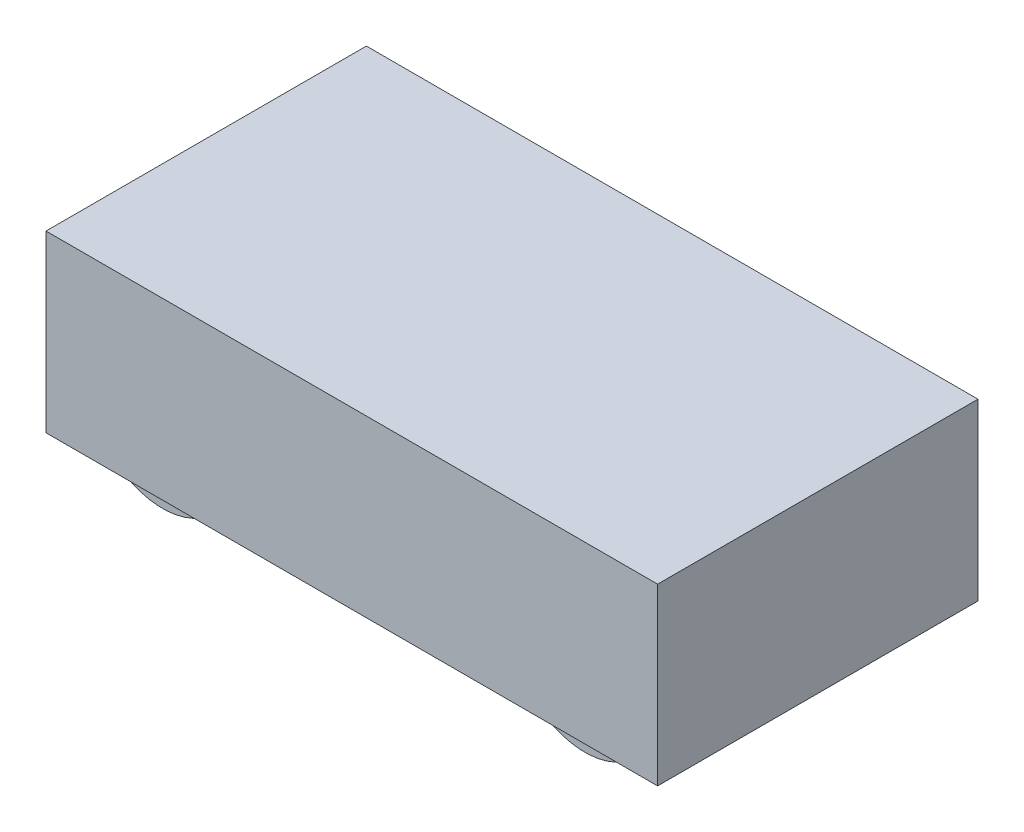
ISO-10303-21;
HEADER;
FILE_DESCRIPTION(('STEP AP214'),'2;1');
FILE_NAME('part.step','',(''),(''),'','','');
FILE_SCHEMA(('AUTOMOTIVE_DESIGN { 1 0 10303 214 1 1 1 1 }'));
ENDSEC;
DATA;
#1=APPLICATION_CONTEXT('core data for automotive mechanical design processes');
#2=APPLICATION_PROTOCOL_DEFINITION('international standard','automotive_design',2000,#1);
#3=PRODUCT_CONTEXT('',#1,'mechanical');
#4=PRODUCT('Part','Part','',(#3));
#5=PRODUCT_RELATED_PRODUCT_CATEGORY('part','',(#4));
#6=PRODUCT_DEFINITION_FORMATION('','',#4);
#7=PRODUCT_DEFINITION_CONTEXT('part definition',#1,'design');
#8=PRODUCT_DEFINITION('design','',#6,#7);
#9=PRODUCT_DEFINITION_SHAPE('','',#8);
#10=(LENGTH_UNIT() NAMED_UNIT(*) SI_UNIT(.MILLI.,.METRE.));
#11=(NAMED_UNIT(*) PLANE_ANGLE_UNIT() SI_UNIT($,.RADIAN.));
#12=(NAMED_UNIT(*) SI_UNIT($,.STERADIAN.) SOLID_ANGLE_UNIT());
#13=UNCERTAINTY_MEASURE_WITH_UNIT(LENGTH_MEASURE(1.E-05),#10,'distance_accuracy_value','');
#14=(GEOMETRIC_REPRESENTATION_CONTEXT(3) GLOBAL_UNCERTAINTY_ASSIGNED_CONTEXT((#13)) GLOBAL_UNIT_ASSIGNED_CONTEXT((#10,
#11,#12)) REPRESENTATION_CONTEXT('',''));
#15=CARTESIAN_POINT('',(0.,0.,0.));
#16=DIRECTION('',(0.,0.,1.));
#17=DIRECTION('',(1.,0.,0.));
#18=AXIS2_PLACEMENT_3D('',#15,#16,#17);
#19=CARTESIAN_POINT('',(0.,0.,0.));
#20=DIRECTION('',(0.,-1.,0.));
#21=DIRECTION('',(0.,0.,-1.));
#22=AXIS2_PLACEMENT_3D('',#19,#20,#21);
#23=PLANE('',#22);
#24=DIRECTION('',(0.,0.,-1.));
#25=VECTOR('',#24,1.);
#26=CARTESIAN_POINT('',(-266.7,0.,139.7));
#27=LINE('',#26,#25);
#28=CARTESIAN_POINT('',(-266.7,0.,139.7));
#29=VERTEX_POINT('',#28);
#30=CARTESIAN_POINT('',(-266.7,0.,-139.7));
#31=VERTEX_POINT('',#30);
#32=EDGE_CURVE('E206',#29,#31,#27,.T.);
#33=ORIENTED_EDGE('',*,*,#32,.T.);
#34=DIRECTION('',(1.,0.,0.));
#35=VECTOR('',#34,1.);
#36=CARTESIAN_POINT('',(-266.7,0.,-139.7));
#37=LINE('',#36,#35);
#38=CARTESIAN_POINT('',(266.7,0.,-139.7));
#39=VERTEX_POINT('',#38);
#40=EDGE_CURVE('E221',#31,#39,#37,.T.);
#41=ORIENTED_EDGE('',*,*,#40,.T.);
#42=DIRECTION('',(0.,0.,-1.));
#43=VECTOR('',#42,1.);
#44=CARTESIAN_POINT('',(266.7,0.,139.7));
#45=LINE('',#44,#43);
#46=CARTESIAN_POINT('',(266.7,0.,139.7));
#47=VERTEX_POINT('',#46);
#48=EDGE_CURVE('E224',#47,#39,#45,.T.);
#49=ORIENTED_EDGE('',*,*,#48,.F.);
#50=DIRECTION('',(1.,0.,0.));
#51=VECTOR('',#50,1.);
#52=CARTESIAN_POINT('',(-266.7,0.,139.7));
#53=LINE('',#52,#51);
#54=EDGE_CURVE('E211',#29,#47,#53,.T.);
#55=ORIENTED_EDGE('',*,*,#54,.F.);
#56=EDGE_LOOP('',(#33,#41,#49,#55));
#57=FACE_BOUND('',#56,.T.);
#58=DIRECTION('',(0.,0.,-1.));
#59=VECTOR('',#58,1.);
#60=CARTESIAN_POINT('',(-234.95,0.,69.85));
#61=LINE('',#60,#59);
#62=CARTESIAN_POINT('',(-234.95,0.,69.85));
#63=VERTEX_POINT('',#62);
#64=CARTESIAN_POINT('',(-234.95,0.,120.65));
#65=VERTEX_POINT('',#64);
#66=EDGE_CURVE('E242',#63,#65,#61,.F.);
#67=ORIENTED_EDGE('',*,*,#66,.T.);
#68=DIRECTION('',(1.,0.,0.));
#69=VECTOR('',#68,1.);
#70=CARTESIAN_POINT('',(0.,0.,120.65));
#71=LINE('',#70,#69);
#72=CARTESIAN_POINT('',(-133.35,0.,120.65));
#73=VERTEX_POINT('',#72);
#74=EDGE_CURVE('E245',#65,#73,#71,.T.);
#75=ORIENTED_EDGE('',*,*,#74,.T.);
#76=DIRECTION('',(0.,0.,-1.));
#77=VECTOR('',#76,1.);
#78=CARTESIAN_POINT('',(-133.35,0.,69.85));
#79=LINE('',#78,#77);
#80=CARTESIAN_POINT('',(-133.35,0.,69.8500000000001));
#81=VERTEX_POINT('',#80);
#82=EDGE_CURVE('E239',#73,#81,#79,.T.);
#83=ORIENTED_EDGE('',*,*,#82,.T.);
#84=DIRECTION('',(-1.,0.,0.));
#85=VECTOR('',#84,1.);
#86=CARTESIAN_POINT('',(0.,0.,69.8500000000001));
#87=LINE('',#86,#85);
#88=EDGE_CURVE('E230',#81,#63,#87,.T.);
#89=ORIENTED_EDGE('',*,*,#88,.T.);
#90=EDGE_LOOP('',(#67,#75,#83,#89));
#91=FACE_BOUND('',#90,.T.);
#92=DIRECTION('',(0.,0.,1.));
#93=VECTOR('',#92,1.);
#94=CARTESIAN_POINT('',(-133.35,0.,-69.85));
#95=LINE('',#94,#93);
#96=CARTESIAN_POINT('',(-133.35,0.,-69.8500000000001));
#97=VERTEX_POINT('',#96);
#98=CARTESIAN_POINT('',(-133.35,0.,-120.65));
#99=VERTEX_POINT('',#98);
#100=EDGE_CURVE('E254',#97,#99,#95,.F.);
#101=ORIENTED_EDGE('',*,*,#100,.T.);
#102=DIRECTION('',(-1.,0.,0.));
#103=VECTOR('',#102,1.);
#104=CARTESIAN_POINT('',(0.,0.,-120.65));
#105=LINE('',#104,#103);
#106=CARTESIAN_POINT('',(-234.95,0.,-120.65));
#107=VERTEX_POINT('',#106);
#108=EDGE_CURVE('E257',#99,#107,#105,.T.);
#109=ORIENTED_EDGE('',*,*,#108,.T.);
#110=DIRECTION('',(0.,0.,1.));
#111=VECTOR('',#110,1.);
#112=CARTESIAN_POINT('',(-234.95,0.,-69.85));
#113=LINE('',#112,#111);
#114=CARTESIAN_POINT('',(-234.95,0.,-69.85));
#115=VERTEX_POINT('',#114);
#116=EDGE_CURVE('E251',#107,#115,#113,.T.);
#117=ORIENTED_EDGE('',*,*,#116,.T.);
#118=DIRECTION('',(1.,0.,0.));
#119=VECTOR('',#118,1.);
#120=CARTESIAN_POINT('',(0.,0.,-69.8500000000001));
#121=LINE('',#120,#119);
#122=EDGE_CURVE('E248',#115,#97,#121,.T.);
#123=ORIENTED_EDGE('',*,*,#122,.T.);
#124=EDGE_LOOP('',(#101,#109,#117,#123));
#125=FACE_BOUND('',#124,.T.);
#126=DIRECTION('',(0.,0.,-1.));
#127=VECTOR('',#126,1.);
#128=CARTESIAN_POINT('',(133.35,0.,69.85));
#129=LINE('',#128,#127);
#130=CARTESIAN_POINT('',(133.35,0.,69.8500000000001));
#131=VERTEX_POINT('',#130);
#132=CARTESIAN_POINT('',(133.35,0.,120.65));
#133=VERTEX_POINT('',#132);
#134=EDGE_CURVE('E266',#131,#133,#129,.F.);
#135=ORIENTED_EDGE('',*,*,#134,.T.);
#136=DIRECTION('',(1.,0.,0.));
#137=VECTOR('',#136,1.);
#138=CARTESIAN_POINT('',(0.,0.,120.65));
#139=LINE('',#138,#137);
#140=CARTESIAN_POINT('',(234.95,0.,120.65));
#141=VERTEX_POINT('',#140);
#142=EDGE_CURVE('E269',#133,#141,#139,.T.);
#143=ORIENTED_EDGE('',*,*,#142,.T.);
#144=DIRECTION('',(0.,0.,-1.));
#145=VECTOR('',#144,1.);
#146=CARTESIAN_POINT('',(234.95,0.,69.85));
#147=LINE('',#146,#145);
#148=CARTESIAN_POINT('',(234.95,0.,69.85));
#149=VERTEX_POINT('',#148);
#150=EDGE_CURVE('E263',#141,#149,#147,.T.);
#151=ORIENTED_EDGE('',*,*,#150,.T.);
#152=DIRECTION('',(-1.,0.,0.));
#153=VECTOR('',#152,1.);
#154=CARTESIAN_POINT('',(0.,0.,69.8500000000001));
#155=LINE('',#154,#153);
#156=EDGE_CURVE('E260',#149,#131,#155,.T.);
#157=ORIENTED_EDGE('',*,*,#156,.T.);
#158=EDGE_LOOP('',(#135,#143,#151,#157));
#159=FACE_BOUND('',#158,.T.);
#160=DIRECTION('',(0.,0.,1.));
#161=VECTOR('',#160,1.);
#162=CARTESIAN_POINT('',(234.95,0.,-69.85));
#163=LINE('',#162,#161);
#164=CARTESIAN_POINT('',(234.95,0.,-69.85));
#165=VERTEX_POINT('',#164);
#166=CARTESIAN_POINT('',(234.95,0.,-120.65));
#167=VERTEX_POINT('',#166);
#168=EDGE_CURVE('E42',#165,#167,#163,.F.);
#169=ORIENTED_EDGE('',*,*,#168,.T.);
#170=DIRECTION('',(-1.,0.,0.));
#171=VECTOR('',#170,1.);
#172=CARTESIAN_POINT('',(0.,0.,-120.65));
#173=LINE('',#172,#171);
#174=CARTESIAN_POINT('',(133.35,0.,-120.65));
#175=VERTEX_POINT('',#174);
#176=EDGE_CURVE('E11',#167,#175,#173,.T.);
#177=ORIENTED_EDGE('',*,*,#176,.T.);
#178=DIRECTION('',(0.,0.,1.));
#179=VECTOR('',#178,1.);
#180=CARTESIAN_POINT('',(133.35,0.,-69.85));
#181=LINE('',#180,#179);
#182=CARTESIAN_POINT('',(133.35,0.,-69.8500000000001));
#183=VERTEX_POINT('',#182);
#184=EDGE_CURVE('E275',#175,#183,#181,.T.);
#185=ORIENTED_EDGE('',*,*,#184,.T.);
#186=DIRECTION('',(1.,0.,0.));
#187=VECTOR('',#186,1.);
#188=CARTESIAN_POINT('',(0.,0.,-69.8500000000001));
#189=LINE('',#188,#187);
#190=EDGE_CURVE('E272',#183,#165,#189,.T.);
#191=ORIENTED_EDGE('',*,*,#190,.T.);
#192=EDGE_LOOP('',(#169,#177,#185,#191));
#193=FACE_BOUND('',#192,.T.);
#194=ADVANCED_FACE('F34',(#57,#91,#125,#159,#193),#23,.T.);
#195=CARTESIAN_POINT('',(-266.7,152.4,139.7));
#196=DIRECTION('',(-1.,0.,0.));
#197=DIRECTION('',(0.,0.,1.));
#198=AXIS2_PLACEMENT_3D('',#195,#196,#197);
#199=PLANE('',#198);
#200=DIRECTION('',(0.,-1.,0.));
#201=VECTOR('',#200,1.);
#202=CARTESIAN_POINT('',(-266.7,50.8,-50.8));
#203=LINE('',#202,#201);
#204=CARTESIAN_POINT('',(-266.7,50.8,-50.8));
#205=VERTEX_POINT('',#204);
#206=CARTESIAN_POINT('',(-266.7,38.1,-50.8));
#207=VERTEX_POINT('',#206);
#208=EDGE_CURVE('E49',#205,#207,#203,.T.);
#209=ORIENTED_EDGE('',*,*,#208,.F.);
#210=DIRECTION('',(0.,0.,-1.));
#211=VECTOR('',#210,1.);
#212=CARTESIAN_POINT('',(-266.7,50.8,-50.8));
#213=LINE('',#212,#211);
#214=CARTESIAN_POINT('',(-266.7,50.8,50.8));
#215=VERTEX_POINT('',#214);
#216=EDGE_CURVE('E167',#215,#205,#213,.T.);
#217=ORIENTED_EDGE('',*,*,#216,.F.);
#218=DIRECTION('',(0.,1.,0.));
#219=VECTOR('',#218,1.);
#220=CARTESIAN_POINT('',(-266.7,50.8,50.8));
#221=LINE('',#220,#219);
#222=CARTESIAN_POINT('',(-266.7,38.1,50.8));
#223=VERTEX_POINT('',#222);
#224=EDGE_CURVE('E170',#223,#215,#221,.T.);
#225=ORIENTED_EDGE('',*,*,#224,.F.);
#226=DIRECTION('',(0.,0.,1.));
#227=VECTOR('',#226,1.);
#228=CARTESIAN_POINT('',(-266.7,38.1,-50.8));
#229=LINE('',#228,#227);
#230=EDGE_CURVE('E176',#207,#223,#229,.T.);
#231=ORIENTED_EDGE('',*,*,#230,.F.);
#232=EDGE_LOOP('',(#209,#217,#225,#231));
#233=FACE_BOUND('',#232,.T.);
#234=ORIENTED_EDGE('',*,*,#32,.F.);
#235=DIRECTION('',(0.,-1.,0.));
#236=VECTOR('',#235,1.);
#237=CARTESIAN_POINT('',(-266.7,152.4,139.7));
#238=LINE('',#237,#236);
#239=CARTESIAN_POINT('',(-266.7,152.4,139.7));
#240=VERTEX_POINT('',#239);
#241=EDGE_CURVE('E228',#240,#29,#238,.T.);
#242=ORIENTED_EDGE('',*,*,#241,.F.);
#243=DIRECTION('',(0.,0.,-1.));
#244=VECTOR('',#243,1.);
#245=CARTESIAN_POINT('',(-266.7,152.4,139.7));
#246=LINE('',#245,#244);
#247=CARTESIAN_POINT('',(-266.7,152.4,-139.7));
#248=VERTEX_POINT('',#247);
#249=EDGE_CURVE('E207',#240,#248,#246,.T.);
#250=ORIENTED_EDGE('',*,*,#249,.T.);
#251=DIRECTION('',(0.,-1.,0.));
#252=VECTOR('',#251,1.);
#253=CARTESIAN_POINT('',(-266.7,152.4,-139.7));
#254=LINE('',#253,#252);
#255=EDGE_CURVE('E218',#248,#31,#254,.T.);
#256=ORIENTED_EDGE('',*,*,#255,.T.);
#257=EDGE_LOOP('',(#234,#242,#250,#256));
#258=FACE_BOUND('',#257,.T.);
#259=ADVANCED_FACE('F36',(#233,#258),#199,.T.);
#260=CARTESIAN_POINT('',(-266.7,152.4,139.7));
#261=DIRECTION('',(0.,0.,-1.));
#262=DIRECTION('',(-1.,0.,0.));
#263=AXIS2_PLACEMENT_3D('',#260,#261,#262);
#264=PLANE('',#263);
#265=ORIENTED_EDGE('',*,*,#54,.T.);
#266=DIRECTION('',(0.,-1.,0.));
#267=VECTOR('',#266,1.);
#268=CARTESIAN_POINT('',(266.7,152.4,139.7));
#269=LINE('',#268,#267);
#270=CARTESIAN_POINT('',(266.7,152.4,139.7));
#271=VERTEX_POINT('',#270);
#272=EDGE_CURVE('E231',#271,#47,#269,.T.);
#273=ORIENTED_EDGE('',*,*,#272,.F.);
#274=DIRECTION('',(1.,0.,0.));
#275=VECTOR('',#274,1.);
#276=CARTESIAN_POINT('',(-266.7,152.4,139.7));
#277=LINE('',#276,#275);
#278=EDGE_CURVE('E216',#240,#271,#277,.T.);
#279=ORIENTED_EDGE('',*,*,#278,.F.);
#280=ORIENTED_EDGE('',*,*,#241,.T.);
#281=EDGE_LOOP('',(#265,#273,#279,#280));
#282=FACE_BOUND('',#281,.T.);
#283=ADVANCED_FACE('F300',(#282),#264,.F.);
#284=CARTESIAN_POINT('',(266.7,152.4,139.7));
#285=DIRECTION('',(-1.,0.,0.));
#286=DIRECTION('',(0.,0.,1.));
#287=AXIS2_PLACEMENT_3D('',#284,#285,#286);
#288=PLANE('',#287);
#289=ORIENTED_EDGE('',*,*,#48,.T.);
#290=DIRECTION('',(0.,-1.,0.));
#291=VECTOR('',#290,1.);
#292=CARTESIAN_POINT('',(266.7,152.4,-139.7));
#293=LINE('',#292,#291);
#294=CARTESIAN_POINT('',(266.7,152.4,-139.7));
#295=VERTEX_POINT('',#294);
#296=EDGE_CURVE('E234',#295,#39,#293,.T.);
#297=ORIENTED_EDGE('',*,*,#296,.F.);
#298=DIRECTION('',(0.,0.,-1.));
#299=VECTOR('',#298,1.);
#300=CARTESIAN_POINT('',(266.7,152.4,139.7));
#301=LINE('',#300,#299);
#302=EDGE_CURVE('E214',#271,#295,#301,.T.);
#303=ORIENTED_EDGE('',*,*,#302,.F.);
#304=ORIENTED_EDGE('',*,*,#272,.T.);
#305=EDGE_LOOP('',(#289,#297,#303,#304));
#306=FACE_BOUND('',#305,.T.);
#307=ADVANCED_FACE('F309',(#306),#288,.F.);
#308=CARTESIAN_POINT('',(-266.7,152.4,-139.7));
#309=DIRECTION('',(0.,0.,-1.));
#310=DIRECTION('',(-1.,0.,0.));
#311=AXIS2_PLACEMENT_3D('',#308,#309,#310);
#312=PLANE('',#311);
#313=ORIENTED_EDGE('',*,*,#40,.F.);
#314=ORIENTED_EDGE('',*,*,#255,.F.);
#315=DIRECTION('',(1.,0.,0.));
#316=VECTOR('',#315,1.);
#317=CARTESIAN_POINT('',(-266.7,152.4,-139.7));
#318=LINE('',#317,#316);
#319=EDGE_CURVE('E210',#248,#295,#318,.T.);
#320=ORIENTED_EDGE('',*,*,#319,.T.);
#321=ORIENTED_EDGE('',*,*,#296,.T.);
#322=EDGE_LOOP('',(#313,#314,#320,#321));
#323=FACE_BOUND('',#322,.T.);
#324=ADVANCED_FACE('F312',(#323),#312,.T.);
#325=CARTESIAN_POINT('',(0.,152.4,0.));
#326=DIRECTION('',(0.,-1.,0.));
#327=DIRECTION('',(0.,0.,-1.));
#328=AXIS2_PLACEMENT_3D('',#325,#326,#327);
#329=PLANE('',#328);
#330=ORIENTED_EDGE('',*,*,#249,.F.);
#331=ORIENTED_EDGE('',*,*,#278,.T.);
#332=ORIENTED_EDGE('',*,*,#302,.T.);
#333=ORIENTED_EDGE('',*,*,#319,.F.);
#334=EDGE_LOOP('',(#330,#331,#332,#333));
#335=FACE_BOUND('',#334,.T.);
#336=ADVANCED_FACE('F305',(#335),#329,.F.);
#337=CARTESIAN_POINT('',(-184.15,38.1,69.85));
#338=DIRECTION('',(0.,0.,-1.));
#339=DIRECTION('',(-1.,0.,0.));
#340=AXIS2_PLACEMENT_3D('',#337,#338,#339);
#341=CYLINDRICAL_SURFACE('',#340,63.5);
#342=ORIENTED_EDGE('',*,*,#66,.F.);
#343=CARTESIAN_POINT('',(-184.15,38.1,69.85));
#344=DIRECTION('',(0.,0.,-1.));
#345=DIRECTION('',(-1.,0.,0.));
#346=AXIS2_PLACEMENT_3D('',#343,#344,#345);
#347=CIRCLE('',#346,63.5);
#348=EDGE_CURVE('E201',#81,#63,#347,.T.);
#349=ORIENTED_EDGE('',*,*,#348,.F.);
#350=ORIENTED_EDGE('',*,*,#82,.F.);
#351=CARTESIAN_POINT('',(-184.15,38.1,120.65));
#352=DIRECTION('',(0.,0.,-1.));
#353=DIRECTION('',(-1.,0.,0.));
#354=AXIS2_PLACEMENT_3D('',#351,#352,#353);
#355=CIRCLE('',#354,63.5);
#356=EDGE_CURVE('E203',#73,#65,#355,.T.);
#357=ORIENTED_EDGE('',*,*,#356,.T.);
#358=EDGE_LOOP('',(#342,#349,#350,#357));
#359=FACE_BOUND('',#358,.T.);
#360=ADVANCED_FACE('F319',(#359),#341,.T.);
#361=CARTESIAN_POINT('',(-247.65,38.1,120.65));
#362=DIRECTION('',(0.,0.,-1.));
#363=DIRECTION('',(-1.,0.,0.));
#364=AXIS2_PLACEMENT_3D('',#361,#362,#363);
#365=PLANE('',#364);
#366=ORIENTED_EDGE('',*,*,#74,.F.);
#367=ORIENTED_EDGE('',*,*,#356,.F.);
#368=EDGE_LOOP('',(#366,#367));
#369=FACE_BOUND('',#368,.T.);
#370=ADVANCED_FACE('F335',(#369),#365,.F.);
#371=CARTESIAN_POINT('',(-247.65,38.1,69.85));
#372=DIRECTION('',(0.,0.,1.));
#373=DIRECTION('',(1.,0.,0.));
#374=AXIS2_PLACEMENT_3D('',#371,#372,#373);
#375=PLANE('',#374);
#376=ORIENTED_EDGE('',*,*,#88,.F.);
#377=ORIENTED_EDGE('',*,*,#348,.T.);
#378=EDGE_LOOP('',(#376,#377));
#379=FACE_BOUND('',#378,.T.);
#380=ADVANCED_FACE('F340',(#379),#375,.F.);
#381=CARTESIAN_POINT('',(-184.15,38.1,-69.85));
#382=DIRECTION('',(0.,0.,1.));
#383=DIRECTION('',(-1.,0.,0.));
#384=AXIS2_PLACEMENT_3D('',#381,#382,#383);
#385=CYLINDRICAL_SURFACE('',#384,63.5);
#386=ORIENTED_EDGE('',*,*,#100,.F.);
#387=CARTESIAN_POINT('',(-184.15,38.1,-69.85));
#388=DIRECTION('',(0.,0.,-1.));
#389=DIRECTION('',(-1.,0.,0.));
#390=AXIS2_PLACEMENT_3D('',#387,#388,#389);
#391=CIRCLE('',#390,63.5);
#392=EDGE_CURVE('E195',#97,#115,#391,.T.);
#393=ORIENTED_EDGE('',*,*,#392,.T.);
#394=ORIENTED_EDGE('',*,*,#116,.F.);
#395=CARTESIAN_POINT('',(-184.15,38.1,-120.65));
#396=DIRECTION('',(0.,0.,-1.));
#397=DIRECTION('',(-1.,0.,0.));
#398=AXIS2_PLACEMENT_3D('',#395,#396,#397);
#399=CIRCLE('',#398,63.5);
#400=EDGE_CURVE('E198',#99,#107,#399,.T.);
#401=ORIENTED_EDGE('',*,*,#400,.F.);
#402=EDGE_LOOP('',(#386,#393,#394,#401));
#403=FACE_BOUND('',#402,.T.);
#404=ADVANCED_FACE('F347',(#403),#385,.T.);
#405=CARTESIAN_POINT('',(-247.65,38.1,-120.65));
#406=DIRECTION('',(0.,0.,1.));
#407=DIRECTION('',(-1.,0.,0.));
#408=AXIS2_PLACEMENT_3D('',#405,#406,#407);
#409=PLANE('',#408);
#410=ORIENTED_EDGE('',*,*,#108,.F.);
#411=ORIENTED_EDGE('',*,*,#400,.T.);
#412=EDGE_LOOP('',(#410,#411));
#413=FACE_BOUND('',#412,.T.);
#414=ADVANCED_FACE('F351',(#413),#409,.F.);
#415=CARTESIAN_POINT('',(-247.65,38.1,-69.85));
#416=DIRECTION('',(0.,0.,-1.));
#417=DIRECTION('',(1.,0.,0.));
#418=AXIS2_PLACEMENT_3D('',#415,#416,#417);
#419=PLANE('',#418);
#420=ORIENTED_EDGE('',*,*,#122,.F.);
#421=ORIENTED_EDGE('',*,*,#392,.F.);
#422=EDGE_LOOP('',(#420,#421));
#423=FACE_BOUND('',#422,.T.);
#424=ADVANCED_FACE('F355',(#423),#419,.F.);
#425=CARTESIAN_POINT('',(184.15,38.1,69.85));
#426=DIRECTION('',(0.,0.,-1.));
#427=DIRECTION('',(1.,0.,0.));
#428=AXIS2_PLACEMENT_3D('',#425,#426,#427);
#429=CYLINDRICAL_SURFACE('',#428,63.5);
#430=ORIENTED_EDGE('',*,*,#134,.F.);
#431=CARTESIAN_POINT('',(184.15,38.1,69.85));
#432=DIRECTION('',(0.,0.,1.));
#433=DIRECTION('',(1.,0.,0.));
#434=AXIS2_PLACEMENT_3D('',#431,#432,#433);
#435=CIRCLE('',#434,63.5);
#436=EDGE_CURVE('E189',#131,#149,#435,.T.);
#437=ORIENTED_EDGE('',*,*,#436,.T.);
#438=ORIENTED_EDGE('',*,*,#150,.F.);
#439=CARTESIAN_POINT('',(184.15,38.1,120.65));
#440=DIRECTION('',(0.,0.,1.));
#441=DIRECTION('',(1.,0.,0.));
#442=AXIS2_PLACEMENT_3D('',#439,#440,#441);
#443=CIRCLE('',#442,63.5);
#444=EDGE_CURVE('E192',#133,#141,#443,.T.);
#445=ORIENTED_EDGE('',*,*,#444,.F.);
#446=EDGE_LOOP('',(#430,#437,#438,#445));
#447=FACE_BOUND('',#446,.T.);
#448=ADVANCED_FACE('F359',(#447),#429,.T.);
#449=CARTESIAN_POINT('',(247.65,38.1,120.65));
#450=DIRECTION('',(0.,0.,-1.));
#451=DIRECTION('',(1.,0.,0.));
#452=AXIS2_PLACEMENT_3D('',#449,#450,#451);
#453=PLANE('',#452);
#454=ORIENTED_EDGE('',*,*,#142,.F.);
#455=ORIENTED_EDGE('',*,*,#444,.T.);
#456=EDGE_LOOP('',(#454,#455));
#457=FACE_BOUND('',#456,.T.);
#458=ADVANCED_FACE('F363',(#457),#453,.F.);
#459=CARTESIAN_POINT('',(247.65,38.1,69.85));
#460=DIRECTION('',(0.,0.,1.));
#461=DIRECTION('',(-1.,0.,0.));
#462=AXIS2_PLACEMENT_3D('',#459,#460,#461);
#463=PLANE('',#462);
#464=ORIENTED_EDGE('',*,*,#156,.F.);
#465=ORIENTED_EDGE('',*,*,#436,.F.);
#466=EDGE_LOOP('',(#464,#465));
#467=FACE_BOUND('',#466,.T.);
#468=ADVANCED_FACE('F292',(#467),#463,.F.);
#469=CARTESIAN_POINT('',(184.15,38.1,-69.85));
#470=DIRECTION('',(0.,0.,1.));
#471=DIRECTION('',(1.,0.,0.));
#472=AXIS2_PLACEMENT_3D('',#469,#470,#471);
#473=CYLINDRICAL_SURFACE('',#472,63.5);
#474=ORIENTED_EDGE('',*,*,#168,.F.);
#475=CARTESIAN_POINT('',(184.15,38.1,-69.85));
#476=DIRECTION('',(0.,0.,1.));
#477=DIRECTION('',(1.,0.,0.));
#478=AXIS2_PLACEMENT_3D('',#475,#476,#477);
#479=CIRCLE('',#478,63.5);
#480=EDGE_CURVE('E56',#183,#165,#479,.T.);
#481=ORIENTED_EDGE('',*,*,#480,.F.);
#482=ORIENTED_EDGE('',*,*,#184,.F.);
#483=CARTESIAN_POINT('',(184.15,38.1,-120.65));
#484=DIRECTION('',(0.,0.,1.));
#485=DIRECTION('',(1.,0.,0.));
#486=AXIS2_PLACEMENT_3D('',#483,#484,#485);
#487=CIRCLE('',#486,63.5);
#488=EDGE_CURVE('E186',#175,#167,#487,.T.);
#489=ORIENTED_EDGE('',*,*,#488,.T.);
#490=EDGE_LOOP('',(#474,#481,#482,#489));
#491=FACE_BOUND('',#490,.T.);
#492=ADVANCED_FACE('F280',(#491),#473,.T.);
#493=CARTESIAN_POINT('',(247.65,38.1,-120.65));
#494=DIRECTION('',(0.,0.,1.));
#495=DIRECTION('',(1.,0.,0.));
#496=AXIS2_PLACEMENT_3D('',#493,#494,#495);
#497=PLANE('',#496);
#498=ORIENTED_EDGE('',*,*,#176,.F.);
#499=ORIENTED_EDGE('',*,*,#488,.F.);
#500=EDGE_LOOP('',(#498,#499));
#501=FACE_BOUND('',#500,.T.);
#502=ADVANCED_FACE('F283',(#501),#497,.F.);
#503=CARTESIAN_POINT('',(247.65,38.1,-69.85));
#504=DIRECTION('',(0.,0.,-1.));
#505=DIRECTION('',(-1.,0.,0.));
#506=AXIS2_PLACEMENT_3D('',#503,#504,#505);
#507=PLANE('',#506);
#508=ORIENTED_EDGE('',*,*,#190,.F.);
#509=ORIENTED_EDGE('',*,*,#480,.T.);
#510=EDGE_LOOP('',(#508,#509));
#511=FACE_BOUND('',#510,.T.);
#512=ADVANCED_FACE('F285',(#511),#507,.F.);
#513=CARTESIAN_POINT('',(-25.4000000000001,50.8,-50.8));
#514=DIRECTION('',(0.,0.,-1.));
#515=DIRECTION('',(-1.,0.,0.));
#516=AXIS2_PLACEMENT_3D('',#513,#514,#515);
#517=PLANE('',#516);
#518=ORIENTED_EDGE('',*,*,#208,.T.);
#519=DIRECTION('',(-1.,0.,0.));
#520=VECTOR('',#519,1.);
#521=CARTESIAN_POINT('',(-25.4000000000001,38.1,-50.8));
#522=LINE('',#521,#520);
#523=CARTESIAN_POINT('',(-25.4000000000001,38.1,-50.8));
#524=VERTEX_POINT('',#523);
#525=EDGE_CURVE('E145',#524,#207,#522,.T.);
#526=ORIENTED_EDGE('',*,*,#525,.F.);
#527=DIRECTION('',(0.,-1.,0.));
#528=VECTOR('',#527,1.);
#529=CARTESIAN_POINT('',(-25.4000000000001,50.8,-50.8));
#530=LINE('',#529,#528);
#531=CARTESIAN_POINT('',(-25.4000000000001,50.8,-50.8));
#532=VERTEX_POINT('',#531);
#533=EDGE_CURVE('E149',#532,#524,#530,.T.);
#534=ORIENTED_EDGE('',*,*,#533,.F.);
#535=DIRECTION('',(-1.,0.,0.));
#536=VECTOR('',#535,1.);
#537=CARTESIAN_POINT('',(-25.4000000000001,50.8,-50.8));
#538=LINE('',#537,#536);
#539=EDGE_CURVE('E180',#532,#205,#538,.T.);
#540=ORIENTED_EDGE('',*,*,#539,.T.);
#541=EDGE_LOOP('',(#518,#526,#534,#540));
#542=FACE_BOUND('',#541,.T.);
#543=ADVANCED_FACE('F147',(#542),#517,.F.);
#544=CARTESIAN_POINT('',(-25.4000000000001,50.8,-50.8));
#545=DIRECTION('',(0.,1.,0.));
#546=DIRECTION('',(0.,0.,1.));
#547=AXIS2_PLACEMENT_3D('',#544,#545,#546);
#548=PLANE('',#547);
#549=ORIENTED_EDGE('',*,*,#216,.T.);
#550=ORIENTED_EDGE('',*,*,#539,.F.);
#551=DIRECTION('',(0.,0.,-1.));
#552=VECTOR('',#551,1.);
#553=CARTESIAN_POINT('',(-25.4000000000001,50.8,-50.8));
#554=LINE('',#553,#552);
#555=CARTESIAN_POINT('',(-25.4000000000001,50.8,50.8));
#556=VERTEX_POINT('',#555);
#557=EDGE_CURVE('E155',#556,#532,#554,.T.);
#558=ORIENTED_EDGE('',*,*,#557,.F.);
#559=DIRECTION('',(-1.,0.,0.));
#560=VECTOR('',#559,1.);
#561=CARTESIAN_POINT('',(-25.4000000000001,50.8,50.8));
#562=LINE('',#561,#560);
#563=EDGE_CURVE('E182',#556,#215,#562,.T.);
#564=ORIENTED_EDGE('',*,*,#563,.T.);
#565=EDGE_LOOP('',(#549,#550,#558,#564));
#566=FACE_BOUND('',#565,.T.);
#567=ADVANCED_FACE('F408',(#566),#548,.F.);
#568=CARTESIAN_POINT('',(-25.4000000000001,50.8,50.8));
#569=DIRECTION('',(0.,0.,1.));
#570=DIRECTION('',(0.,-1.,0.));
#571=AXIS2_PLACEMENT_3D('',#568,#569,#570);
#572=PLANE('',#571);
#573=ORIENTED_EDGE('',*,*,#224,.T.);
#574=ORIENTED_EDGE('',*,*,#563,.F.);
#575=DIRECTION('',(0.,1.,0.));
#576=VECTOR('',#575,1.);
#577=CARTESIAN_POINT('',(-25.4000000000001,50.8,50.8));
#578=LINE('',#577,#576);
#579=CARTESIAN_POINT('',(-25.4000000000001,38.1,50.8));
#580=VERTEX_POINT('',#579);
#581=EDGE_CURVE('E163',#580,#556,#578,.T.);
#582=ORIENTED_EDGE('',*,*,#581,.F.);
#583=DIRECTION('',(-1.,0.,0.));
#584=VECTOR('',#583,1.);
#585=CARTESIAN_POINT('',(-25.4000000000001,38.1,50.8));
#586=LINE('',#585,#584);
#587=EDGE_CURVE('E154',#580,#223,#586,.T.);
#588=ORIENTED_EDGE('',*,*,#587,.T.);
#589=EDGE_LOOP('',(#573,#574,#582,#588));
#590=FACE_BOUND('',#589,.T.);
#591=ADVANCED_FACE('F417',(#590),#572,.F.);
#592=CARTESIAN_POINT('',(-25.4000000000001,38.1,-50.8));
#593=DIRECTION('',(0.,-1.,0.));
#594=DIRECTION('',(0.,0.,-1.));
#595=AXIS2_PLACEMENT_3D('',#592,#593,#594);
#596=PLANE('',#595);
#597=ORIENTED_EDGE('',*,*,#230,.T.);
#598=ORIENTED_EDGE('',*,*,#587,.F.);
#599=DIRECTION('',(0.,0.,1.));
#600=VECTOR('',#599,1.);
#601=CARTESIAN_POINT('',(-25.4000000000001,38.1,-50.8));
#602=LINE('',#601,#600);
#603=EDGE_CURVE('E158',#524,#580,#602,.T.);
#604=ORIENTED_EDGE('',*,*,#603,.F.);
#605=ORIENTED_EDGE('',*,*,#525,.T.);
#606=EDGE_LOOP('',(#597,#598,#604,#605));
#607=FACE_BOUND('',#606,.T.);
#608=ADVANCED_FACE('F159',(#607),#596,.F.);
#609=CARTESIAN_POINT('',(-25.4000000000001,0.,0.));
#610=DIRECTION('',(-1.,0.,0.));
#611=DIRECTION('',(0.,0.,1.));
#612=AXIS2_PLACEMENT_3D('',#609,#610,#611);
#613=PLANE('',#612);
#614=ORIENTED_EDGE('',*,*,#533,.T.);
#615=ORIENTED_EDGE('',*,*,#603,.T.);
#616=ORIENTED_EDGE('',*,*,#581,.T.);
#617=ORIENTED_EDGE('',*,*,#557,.T.);
#618=EDGE_LOOP('',(#614,#615,#616,#617));
#619=FACE_BOUND('',#618,.T.);
#620=ADVANCED_FACE('F165',(#619),#613,.T.);
#621=CLOSED_SHELL('',(#194,#259,#283,#307,#324,#336,#360,#370,#380,#404,#414,#424,#448,#458,
#468,#492,#502,#512,#543,#567,#591,#608,#620));
#622=MANIFOLD_SOLID_BREP('B2',#621);
#623=ADVANCED_BREP_SHAPE_REPRESENTATION('',(#18,#622),#14);
#624=SHAPE_DEFINITION_REPRESENTATION(#9,#623);
ENDSEC;
END-ISO-10303-21;
